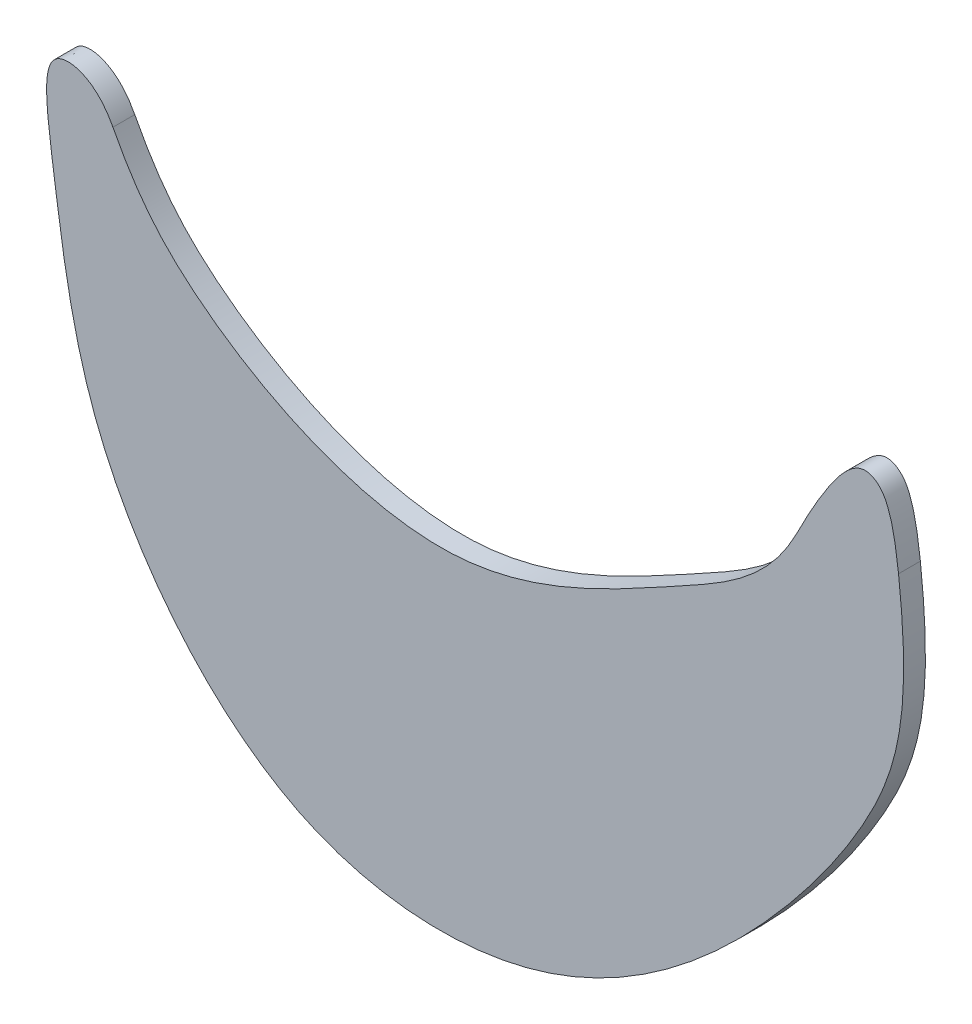
ISO-10303-21;
HEADER;
FILE_DESCRIPTION(('STEP AP214'),'2;1');
FILE_NAME('part.step','',(''),(''),'','','');
FILE_SCHEMA(('AUTOMOTIVE_DESIGN { 1 0 10303 214 1 1 1 1 }'));
ENDSEC;
DATA;
#1=APPLICATION_CONTEXT('core data for automotive mechanical design processes');
#2=APPLICATION_PROTOCOL_DEFINITION('international standard','automotive_design',2000,#1);
#3=PRODUCT_CONTEXT('',#1,'mechanical');
#4=PRODUCT('Part','Part','',(#3));
#5=PRODUCT_RELATED_PRODUCT_CATEGORY('part','',(#4));
#6=PRODUCT_DEFINITION_FORMATION('','',#4);
#7=PRODUCT_DEFINITION_CONTEXT('part definition',#1,'design');
#8=PRODUCT_DEFINITION('design','',#6,#7);
#9=PRODUCT_DEFINITION_SHAPE('','',#8);
#10=(LENGTH_UNIT() NAMED_UNIT(*) SI_UNIT(.MILLI.,.METRE.));
#11=(NAMED_UNIT(*) PLANE_ANGLE_UNIT() SI_UNIT($,.RADIAN.));
#12=(NAMED_UNIT(*) SI_UNIT($,.STERADIAN.) SOLID_ANGLE_UNIT());
#13=UNCERTAINTY_MEASURE_WITH_UNIT(LENGTH_MEASURE(1.E-05),#10,'distance_accuracy_value','');
#14=(GEOMETRIC_REPRESENTATION_CONTEXT(3) GLOBAL_UNCERTAINTY_ASSIGNED_CONTEXT((#13)) GLOBAL_UNIT_ASSIGNED_CONTEXT((#10,
#11,#12)) REPRESENTATION_CONTEXT('',''));
#15=CARTESIAN_POINT('',(0.,0.,0.));
#16=DIRECTION('',(0.,0.,1.));
#17=DIRECTION('',(1.,0.,0.));
#18=AXIS2_PLACEMENT_3D('',#15,#16,#17);
#19=CARTESIAN_POINT('',(-15.5322998497738,16.5411061392675,1.));
#20=CARTESIAN_POINT('',(-16.2024771161477,17.834855775492,1.));
#21=CARTESIAN_POINT('',(-19.173552947589,18.9219310304108,1.));
#22=CARTESIAN_POINT('',(-18.5775026323385,15.8154124988749,1.));
#23=CARTESIAN_POINT('',(-18.1229902917697,12.5416314497861,1.));
#24=B_SPLINE_CURVE_WITH_KNOTS('',3,(#19,#20,#21,#22,#23),.UNSPECIFIED.,.F.,.F.,(4,1,4),(0.,
0.32869687526822,1.),.UNSPECIFIED.);
#25=DIRECTION('',(0.,0.,-1.));
#26=VECTOR('',#25,1.);
#27=SURFACE_OF_LINEAR_EXTRUSION('',#24,#26);
#28=CARTESIAN_POINT('',(-15.5322998497738,16.5411061392675,0.));
#29=CARTESIAN_POINT('',(-16.2024771161477,17.834855775492,0.));
#30=CARTESIAN_POINT('',(-19.173552947589,18.9219310304108,0.));
#31=CARTESIAN_POINT('',(-18.5775026323385,15.8154124988749,0.));
#32=CARTESIAN_POINT('',(-18.1229902917697,12.5416314497861,0.));
#33=B_SPLINE_CURVE_WITH_KNOTS('',3,(#28,#29,#30,#31,#32),.UNSPECIFIED.,.F.,.F.,(4,1,4),(0.,
0.32869687526822,1.),.UNSPECIFIED.);
#34=CARTESIAN_POINT('',(-15.5322998497738,16.5411061392675,0.));
#35=VERTEX_POINT('',#34);
#36=CARTESIAN_POINT('',(-18.1229902917697,12.5416314497861,0.));
#37=VERTEX_POINT('',#36);
#38=EDGE_CURVE('E133',#35,#37,#33,.T.);
#39=ORIENTED_EDGE('',*,*,#38,.T.);
#40=DIRECTION('',(0.,0.,-1.));
#41=VECTOR('',#40,1.);
#42=CARTESIAN_POINT('',(-18.1229902917697,12.5416314497861,1.));
#43=LINE('',#42,#41);
#44=CARTESIAN_POINT('',(-18.1229902917697,12.5416314497861,1.));
#45=VERTEX_POINT('',#44);
#46=EDGE_CURVE('E11',#45,#37,#43,.T.);
#47=ORIENTED_EDGE('',*,*,#46,.F.);
#48=CARTESIAN_POINT('',(-15.5322998497738,16.5411061392675,1.));
#49=VERTEX_POINT('',#48);
#50=EDGE_CURVE('E92',#49,#45,#24,.T.);
#51=ORIENTED_EDGE('',*,*,#50,.F.);
#52=DIRECTION('',(0.,0.,-1.));
#53=VECTOR('',#52,1.);
#54=CARTESIAN_POINT('',(-15.5322998497738,16.5411061392675,1.));
#55=LINE('',#54,#53);
#56=EDGE_CURVE('E104',#49,#35,#55,.T.);
#57=ORIENTED_EDGE('',*,*,#56,.T.);
#58=EDGE_LOOP('',(#39,#47,#51,#57));
#59=FACE_BOUND('',#58,.T.);
#60=ADVANCED_FACE('F39',(#59),#27,.F.);
#61=CARTESIAN_POINT('',(-18.1229902917697,12.5416314497861,1.));
#62=CARTESIAN_POINT('',(-17.5660646778598,8.53018366755741,1.));
#63=CARTESIAN_POINT('',(-16.1608529297402,1.94715561312192,1.));
#64=CARTESIAN_POINT('',(-8.18423251701128,-7.59827417501518,1.));
#65=CARTESIAN_POINT('',(4.73522076658322,-8.42518170743621,1.));
#66=CARTESIAN_POINT('',(13.3281393099506,-1.91232018757537,1.));
#67=CARTESIAN_POINT('',(20.0706420974663,7.31691704532812,1.));
#68=CARTESIAN_POINT('',(21.0295669131172,11.608878007323,1.));
#69=CARTESIAN_POINT('',(20.4399033214026,16.8197485288156,1.));
#70=B_SPLINE_CURVE_WITH_KNOTS('',3,(#61,#62,#63,#64,#65,#66,#67,#68,#69),.UNSPECIFIED.,.F.,.F.,
(4,1,1,1,1,1,4),(0.,0.156426268079861,0.36061937895947,0.502020338879188,0.714995236680106,
0.83668892663726,1.),.UNSPECIFIED.);
#71=DIRECTION('',(0.,0.,-1.));
#72=VECTOR('',#71,1.);
#73=SURFACE_OF_LINEAR_EXTRUSION('',#70,#72);
#74=CARTESIAN_POINT('',(-18.1229902917697,12.5416314497861,0.));
#75=CARTESIAN_POINT('',(-17.5660646778598,8.53018366755741,0.));
#76=CARTESIAN_POINT('',(-16.1608529297402,1.94715561312192,0.));
#77=CARTESIAN_POINT('',(-8.18423251701128,-7.59827417501518,0.));
#78=CARTESIAN_POINT('',(4.73522076658322,-8.42518170743621,0.));
#79=CARTESIAN_POINT('',(13.3281393099506,-1.91232018757537,0.));
#80=CARTESIAN_POINT('',(20.0706420974663,7.31691704532812,0.));
#81=CARTESIAN_POINT('',(21.0295669131172,11.608878007323,0.));
#82=CARTESIAN_POINT('',(20.4399033214026,16.8197485288156,0.));
#83=B_SPLINE_CURVE_WITH_KNOTS('',3,(#74,#75,#76,#77,#78,#79,#80,#81,#82),.UNSPECIFIED.,.F.,.F.,
(4,1,1,1,1,1,4),(0.,0.156426268079861,0.36061937895947,0.502020338879188,0.714995236680106,
0.83668892663726,1.),.UNSPECIFIED.);
#84=CARTESIAN_POINT('',(20.4399033214026,16.8197485288156,0.));
#85=VERTEX_POINT('',#84);
#86=EDGE_CURVE('E97',#37,#85,#83,.T.);
#87=ORIENTED_EDGE('',*,*,#86,.T.);
#88=DIRECTION('',(0.,0.,-1.));
#89=VECTOR('',#88,1.);
#90=CARTESIAN_POINT('',(20.4399033214026,16.8197485288156,1.));
#91=LINE('',#90,#89);
#92=CARTESIAN_POINT('',(20.4399033214026,16.8197485288156,1.));
#93=VERTEX_POINT('',#92);
#94=EDGE_CURVE('E49',#93,#85,#91,.T.);
#95=ORIENTED_EDGE('',*,*,#94,.F.);
#96=EDGE_CURVE('E87',#45,#93,#70,.T.);
#97=ORIENTED_EDGE('',*,*,#96,.F.);
#98=ORIENTED_EDGE('',*,*,#46,.T.);
#99=EDGE_LOOP('',(#87,#95,#97,#98));
#100=FACE_BOUND('',#99,.T.);
#101=ADVANCED_FACE('F96',(#100),#73,.F.);
#102=CARTESIAN_POINT('',(20.4399033214026,16.8197485288156,1.));
#103=CARTESIAN_POINT('',(20.1823319745833,19.0959123571079,1.));
#104=CARTESIAN_POINT('',(19.2230229133234,20.7146469609112,1.));
#105=CARTESIAN_POINT('',(17.7819704409315,20.051783194819,1.));
#106=CARTESIAN_POINT('',(15.7888954949727,16.1068406079867,1.));
#107=B_SPLINE_CURVE_WITH_KNOTS('',3,(#102,#103,#104,#105,#106),.UNSPECIFIED.,.F.,.F.,(4,1,4),
(0.,0.388798233886126,1.),.UNSPECIFIED.);
#108=DIRECTION('',(0.,0.,-1.));
#109=VECTOR('',#108,1.);
#110=SURFACE_OF_LINEAR_EXTRUSION('',#107,#109);
#111=CARTESIAN_POINT('',(20.4399033214026,16.8197485288156,0.));
#112=CARTESIAN_POINT('',(20.1823319745833,19.0959123571079,0.));
#113=CARTESIAN_POINT('',(19.2230229133234,20.7146469609112,0.));
#114=CARTESIAN_POINT('',(17.7819704409315,20.051783194819,0.));
#115=CARTESIAN_POINT('',(15.7888954949727,16.1068406079867,0.));
#116=B_SPLINE_CURVE_WITH_KNOTS('',3,(#111,#112,#113,#114,#115),.UNSPECIFIED.,.F.,.F.,(4,1,4),
(0.,0.388798233886126,1.),.UNSPECIFIED.);
#117=CARTESIAN_POINT('',(15.7888954949727,16.1068406079867,0.));
#118=VERTEX_POINT('',#117);
#119=EDGE_CURVE('E74',#85,#118,#116,.T.);
#120=ORIENTED_EDGE('',*,*,#119,.T.);
#121=DIRECTION('',(0.,0.,-1.));
#122=VECTOR('',#121,1.);
#123=CARTESIAN_POINT('',(15.7888954949727,16.1068406079867,1.));
#124=LINE('',#123,#122);
#125=CARTESIAN_POINT('',(15.7888954949727,16.1068406079867,1.));
#126=VERTEX_POINT('',#125);
#127=EDGE_CURVE('E99',#126,#118,#124,.T.);
#128=ORIENTED_EDGE('',*,*,#127,.F.);
#129=EDGE_CURVE('E90',#93,#126,#107,.T.);
#130=ORIENTED_EDGE('',*,*,#129,.F.);
#131=ORIENTED_EDGE('',*,*,#94,.T.);
#132=EDGE_LOOP('',(#120,#128,#130,#131));
#133=FACE_BOUND('',#132,.T.);
#134=ADVANCED_FACE('F100',(#133),#110,.F.);
#135=CARTESIAN_POINT('',(15.7888954949727,16.1068406079867,1.));
#136=CARTESIAN_POINT('',(14.4901213770908,13.5361448402753,1.));
#137=CARTESIAN_POINT('',(9.43647896491019,10.8310930018704,1.));
#138=CARTESIAN_POINT('',(-0.194246697780859,5.3234570090749,1.));
#139=CARTESIAN_POINT('',(-10.8456051513789,10.3367978869866,1.));
#140=CARTESIAN_POINT('',(-14.373592373984,14.3042690358473,1.));
#141=CARTESIAN_POINT('',(-15.5322998497738,16.5411061392675,1.));
#142=B_SPLINE_CURVE_WITH_KNOTS('',3,(#135,#136,#137,#138,#139,#140,#141),.UNSPECIFIED.,.F.,.F.,
(4,1,1,1,4),(0.,0.194387691561774,0.496185553204349,0.835769380590361,1.),.UNSPECIFIED.);
#143=DIRECTION('',(0.,0.,-1.));
#144=VECTOR('',#143,1.);
#145=SURFACE_OF_LINEAR_EXTRUSION('',#142,#144);
#146=CARTESIAN_POINT('',(15.7888954949727,16.1068406079867,0.));
#147=CARTESIAN_POINT('',(14.4901213770908,13.5361448402753,0.));
#148=CARTESIAN_POINT('',(9.43647896491019,10.8310930018704,0.));
#149=CARTESIAN_POINT('',(-0.194246697780859,5.3234570090749,0.));
#150=CARTESIAN_POINT('',(-10.8456051513789,10.3367978869866,0.));
#151=CARTESIAN_POINT('',(-14.373592373984,14.3042690358473,0.));
#152=CARTESIAN_POINT('',(-15.5322998497738,16.5411061392675,0.));
#153=B_SPLINE_CURVE_WITH_KNOTS('',3,(#146,#147,#148,#149,#150,#151,#152),.UNSPECIFIED.,.F.,.F.,
(4,1,1,1,4),(0.,0.194387691561774,0.496185553204349,0.835769380590361,1.),.UNSPECIFIED.);
#154=EDGE_CURVE('E80',#118,#35,#153,.T.);
#155=ORIENTED_EDGE('',*,*,#154,.T.);
#156=ORIENTED_EDGE('',*,*,#56,.F.);
#157=EDGE_CURVE('E57',#126,#49,#142,.T.);
#158=ORIENTED_EDGE('',*,*,#157,.F.);
#159=ORIENTED_EDGE('',*,*,#127,.T.);
#160=EDGE_LOOP('',(#155,#156,#158,#159));
#161=FACE_BOUND('',#160,.T.);
#162=ADVANCED_FACE('F122',(#161),#145,.F.);
#163=CARTESIAN_POINT('',(-18.4063272956441,17.5891600695184,1.));
#164=DIRECTION('',(0.,0.,-1.));
#165=DIRECTION('',(-1.,0.,0.));
#166=AXIS2_PLACEMENT_3D('',#163,#164,#165);
#167=PLANE('',#166);
#168=ORIENTED_EDGE('',*,*,#50,.T.);
#169=ORIENTED_EDGE('',*,*,#96,.T.);
#170=ORIENTED_EDGE('',*,*,#129,.T.);
#171=ORIENTED_EDGE('',*,*,#157,.T.);
#172=EDGE_LOOP('',(#168,#169,#170,#171));
#173=FACE_BOUND('',#172,.T.);
#174=ADVANCED_FACE('F88',(#173),#167,.F.);
#175=CARTESIAN_POINT('',(-18.4063272956441,17.5891600695184,0.));
#176=DIRECTION('',(0.,0.,-1.));
#177=DIRECTION('',(-1.,0.,0.));
#178=AXIS2_PLACEMENT_3D('',#175,#176,#177);
#179=PLANE('',#178);
#180=ORIENTED_EDGE('',*,*,#38,.F.);
#181=ORIENTED_EDGE('',*,*,#154,.F.);
#182=ORIENTED_EDGE('',*,*,#119,.F.);
#183=ORIENTED_EDGE('',*,*,#86,.F.);
#184=EDGE_LOOP('',(#180,#181,#182,#183));
#185=FACE_BOUND('',#184,.T.);
#186=ADVANCED_FACE('F166',(#185),#179,.T.);
#187=CLOSED_SHELL('',(#60,#101,#134,#162,#174,#186));
#188=MANIFOLD_SOLID_BREP('B2',#187);
#189=ADVANCED_BREP_SHAPE_REPRESENTATION('',(#18,#188),#14);
#190=SHAPE_DEFINITION_REPRESENTATION(#9,#189);
ENDSEC;
END-ISO-10303-21;
